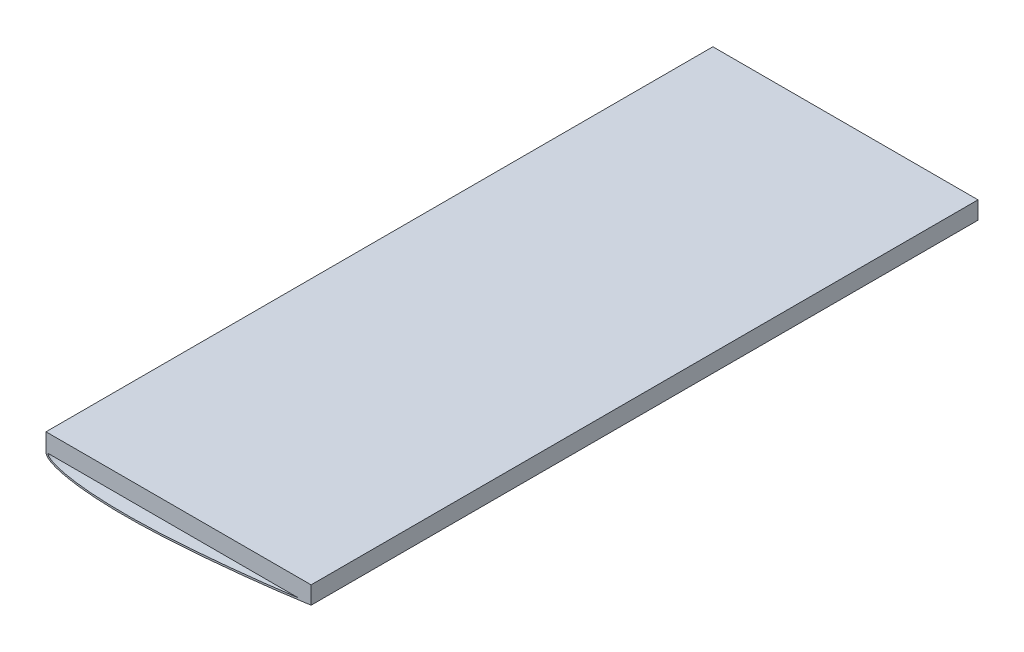
ISO-10303-21;
HEADER;
FILE_DESCRIPTION(('STEP AP214'),'2;1');
FILE_NAME('part.step','',(''),(''),'','','');
FILE_SCHEMA(('AUTOMOTIVE_DESIGN { 1 0 10303 214 1 1 1 1 }'));
ENDSEC;
DATA;
#1=APPLICATION_CONTEXT('core data for automotive mechanical design processes');
#2=APPLICATION_PROTOCOL_DEFINITION('international standard','automotive_design',2000,#1);
#3=PRODUCT_CONTEXT('',#1,'mechanical');
#4=PRODUCT('Part','Part','',(#3));
#5=PRODUCT_RELATED_PRODUCT_CATEGORY('part','',(#4));
#6=PRODUCT_DEFINITION_FORMATION('','',#4);
#7=PRODUCT_DEFINITION_CONTEXT('part definition',#1,'design');
#8=PRODUCT_DEFINITION('design','',#6,#7);
#9=PRODUCT_DEFINITION_SHAPE('','',#8);
#10=(LENGTH_UNIT() NAMED_UNIT(*) SI_UNIT(.MILLI.,.METRE.));
#11=(NAMED_UNIT(*) PLANE_ANGLE_UNIT() SI_UNIT($,.RADIAN.));
#12=(NAMED_UNIT(*) SI_UNIT($,.STERADIAN.) SOLID_ANGLE_UNIT());
#13=UNCERTAINTY_MEASURE_WITH_UNIT(LENGTH_MEASURE(1.E-05),#10,'distance_accuracy_value','');
#14=(GEOMETRIC_REPRESENTATION_CONTEXT(3) GLOBAL_UNCERTAINTY_ASSIGNED_CONTEXT((#13)) GLOBAL_UNIT_ASSIGNED_CONTEXT((#10,
#11,#12)) REPRESENTATION_CONTEXT('',''));
#15=CARTESIAN_POINT('',(0.,0.,0.));
#16=DIRECTION('',(0.,0.,1.));
#17=DIRECTION('',(1.,0.,0.));
#18=AXIS2_PLACEMENT_3D('',#15,#16,#17);
#19=CARTESIAN_POINT('',(73.9593776237791,7.91362684742064,0.));
#20=DIRECTION('',(0.,0.,-1.));
#21=DIRECTION('',(-1.,0.,0.));
#22=AXIS2_PLACEMENT_3D('',#19,#20,#21);
#23=PLANE('',#22);
#24=CARTESIAN_POINT('',(1.00345433177514,2.21139296111006E-12,0.));
#25=CARTESIAN_POINT('',(1.01006277716516,-0.0776382549222592,0.));
#26=CARTESIAN_POINT('',(1.02736996072205,-0.251809473010658,0.));
#27=CARTESIAN_POINT('',(1.05545790737324,-0.39717128165524,0.));
#28=CARTESIAN_POINT('',(1.10122729147491,-0.534433247929432,0.));
#29=CARTESIAN_POINT('',(1.2070060140526,-0.758973422297372,0.));
#30=CARTESIAN_POINT('',(1.39820169123991,-1.05450326915682,0.));
#31=CARTESIAN_POINT('',(1.78376943357382,-1.49652619711913,0.));
#32=CARTESIAN_POINT('',(2.41521318501003,-2.02030968090792,0.));
#33=CARTESIAN_POINT('',(3.5833083365114,-2.75144190561193,0.));
#34=CARTESIAN_POINT('',(5.2207174054757,-3.50583222163235,0.));
#35=CARTESIAN_POINT('',(7.99073904270306,-4.47786552088087,0.));
#36=CARTESIAN_POINT('',(11.6041135023148,-5.3895546083372,0.));
#37=CARTESIAN_POINT('',(16.0269639299858,-6.19324892029823,0.));
#38=CARTESIAN_POINT('',(20.4979671718237,-6.79235105021753,0.));
#39=CARTESIAN_POINT('',(26.4943879599962,-7.38356226543266,0.));
#40=CARTESIAN_POINT('',(34.0293455913172,-7.81417481798339,0.));
#41=CARTESIAN_POINT('',(43.0946015483297,-7.98650915253986,0.));
#42=CARTESIAN_POINT('',(52.1685724547205,-7.89775929132822,0.));
#43=CARTESIAN_POINT('',(61.2431322861648,-7.60624472281697,0.));
#44=CARTESIAN_POINT('',(73.3387179349281,-7.00140776455579,0.));
#45=CARTESIAN_POINT('',(88.4459886292648,-5.91846879559462,0.));
#46=CARTESIAN_POINT('',(106.550096146803,-4.25481208598084,0.));
#47=CARTESIAN_POINT('',(124.627143732398,-2.29752292089651,0.));
#48=CARTESIAN_POINT('',(136.654844648472,-0.802687350619493,0.));
#49=CARTESIAN_POINT('',(142.661446075035,3.04530706207728E-12,0.));
#50=B_SPLINE_CURVE_WITH_KNOTS('',3,(#24,#25,#26,#27,#28,#29,#30,#31,#32,#33,#34,#35,#36,#37,#38,
#39,#40,#41,#42,#43,#44,#45,#46,#47,#48,#49),.UNSPECIFIED.,.F.,.F.,(4,1,1,1,1,1,1,1,1,1,1,1,1,1,
1,1,1,1,1,1,1,1,1,4),(0.00055306123740472,0.00241221186622204,0.00427136249503936,
0.00613051312385668,0.00798966375267401,0.0117079650103086,0.0154262662679433,
0.0228628687832126,0.0302994712984819,0.0451726763290204,0.060045881359559,0.0897922914206361,
0.119538701481713,0.14928511154279,0.179031521603868,0.238524341726022,0.298017161848176,
0.35750998197033,0.417002802092485,0.476495622214639,0.595481262458947,0.714466902703256,
0.833452542947565,0.952438183191873),.UNSPECIFIED.);
#51=CARTESIAN_POINT('',(1.00345433177514,0.,0.));
#52=VERTEX_POINT('',#51);
#53=CARTESIAN_POINT('',(142.661446075035,3.04530706207728E-12,0.));
#54=VERTEX_POINT('',#53);
#55=EDGE_CURVE('E116',#52,#54,#50,.T.);
#56=ORIENTED_EDGE('',*,*,#55,.T.);
#57=DIRECTION('',(-1.,0.,0.));
#58=VECTOR('',#57,1.);
#59=CARTESIAN_POINT('',(0.,0.,0.));
#60=LINE('',#59,#58);
#61=EDGE_CURVE('E110',#54,#52,#60,.T.);
#62=ORIENTED_EDGE('',*,*,#61,.T.);
#63=EDGE_LOOP('',(#56,#62));
#64=FACE_BOUND('',#63,.T.);
#65=DIRECTION('',(0.,-1.,0.));
#66=VECTOR('',#65,1.);
#67=CARTESIAN_POINT('',(150.,10.,0.));
#68=LINE('',#67,#66);
#69=CARTESIAN_POINT('',(150.,10.,0.));
#70=VERTEX_POINT('',#69);
#71=CARTESIAN_POINT('',(150.,0.,0.));
#72=VERTEX_POINT('',#71);
#73=EDGE_CURVE('E114',#70,#72,#68,.T.);
#74=ORIENTED_EDGE('',*,*,#73,.T.);
#75=CARTESIAN_POINT('',(6.43538250505347E-13,1.77635703591191E-12,0.));
#76=CARTESIAN_POINT('',(0.0177376787998455,-0.215631790192353,0.));
#77=CARTESIAN_POINT('',(0.0541247272774031,-0.65797853081827,0.));
#78=CARTESIAN_POINT('',(0.343214491646014,-1.29886256852248,0.));
#79=CARTESIAN_POINT('',(0.793518335307777,-1.91545308538017,0.));
#80=CARTESIAN_POINT('',(1.4185937385033,-2.51041162089577,0.));
#81=CARTESIAN_POINT('',(2.21044072610108,-3.08584076004222,0.));
#82=CARTESIAN_POINT('',(3.16984033745948,-3.6422902701145,0.));
#83=CARTESIAN_POINT('',(4.29476246222991,-4.17912910417955,0.));
#84=CARTESIAN_POINT('',(5.58341356907608,-4.69513940992403,0.));
#85=CARTESIAN_POINT('',(7.03317259205481,-5.18878374333077,0.));
#86=CARTESIAN_POINT('',(8.64096444597695,-5.65840604873474,0.));
#87=CARTESIAN_POINT('',(11.0808665026304,-6.27289235058293,0.));
#88=CARTESIAN_POINT('',(14.5024468626398,-6.95545406858926,0.));
#89=CARTESIAN_POINT('',(19.0332651731454,-7.62778010369679,0.));
#90=CARTESIAN_POINT('',(24.0847382425471,-8.16948510481021,0.));
#91=CARTESIAN_POINT('',(29.6103003795531,-8.57335056911082,0.));
#92=CARTESIAN_POINT('',(36.6534461757643,-8.88420481359231,0.));
#93=CARTESIAN_POINT('',(45.2685528659173,-8.99448588105845,0.));
#94=CARTESIAN_POINT('',(55.4492469291888,-8.82398055942588,0.));
#95=CARTESIAN_POINT('',(67.2471798380365,-8.34657326807739,0.));
#96=CARTESIAN_POINT('',(80.3841274907161,-7.52487589483598,0.));
#97=CARTESIAN_POINT('',(94.4750896656358,-6.38138479152716,0.));
#98=CARTESIAN_POINT('',(108.784193237315,-5.01561269216194,0.));
#99=CARTESIAN_POINT('',(123.127907022394,-3.46129711721086,0.));
#100=CARTESIAN_POINT('',(136.579140490008,-1.82819578052965,0.));
#101=CARTESIAN_POINT('',(145.420848795192,-0.644801769860001,0.));
#102=CARTESIAN_POINT('',(149.505193272768,-0.070051229078369,0.));
#103=CARTESIAN_POINT('',(149.970810303825,-0.00413247027612191,0.));
#104=CARTESIAN_POINT('',(150.000000000001,1.77635683940024E-12,0.));
#105=B_SPLINE_CURVE_WITH_KNOTS('',3,(#75,#76,#77,#78,#79,#80,#81,#82,#83,#84,#85,#86,#87,#88,
#89,#90,#91,#92,#93,#94,#95,#96,#97,#98,#99,#100,#101,#102,#103,#104),.UNSPECIFIED.,.F.,.F.,(4,
1,1,1,1,1,1,1,1,1,1,1,1,1,1,1,1,1,1,1,1,1,1,1,1,1,1,4),(0.,0.00421754175159676,
0.00865185901203598,0.013562306112597,0.0191370143035422,0.0254995560399083,0.0327261684508418,
0.0408616428239496,0.049929831579304,0.0599401249287409,0.0708919813887169,0.082777029169175,
0.109285667338437,0.139301077750872,0.172602406915682,0.208924358464581,0.247964734529063,
0.310881145592701,0.377906082539904,0.447678537728095,0.542484026957861,0.636086647696326,
0.724985378551976,0.824439815821109,0.919092538955119,0.990775422468578,0.999421707975584,1.),.UNSPECIFIED.);
#106=CARTESIAN_POINT('',(6.43538250505347E-13,1.77635703591191E-12,0.));
#107=VERTEX_POINT('',#106);
#108=EDGE_CURVE('E106',#107,#72,#105,.T.);
#109=ORIENTED_EDGE('',*,*,#108,.F.);
#110=DIRECTION('',(0.,-1.,0.));
#111=VECTOR('',#110,1.);
#112=CARTESIAN_POINT('',(0.,10.,0.));
#113=LINE('',#112,#111);
#114=CARTESIAN_POINT('',(0.,10.,0.));
#115=VERTEX_POINT('',#114);
#116=EDGE_CURVE('E53',#115,#107,#113,.T.);
#117=ORIENTED_EDGE('',*,*,#116,.F.);
#118=DIRECTION('',(-1.,0.,0.));
#119=VECTOR('',#118,1.);
#120=CARTESIAN_POINT('',(0.,10.,0.));
#121=LINE('',#120,#119);
#122=EDGE_CURVE('E156',#70,#115,#121,.T.);
#123=ORIENTED_EDGE('',*,*,#122,.F.);
#124=EDGE_LOOP('',(#74,#109,#117,#123));
#125=FACE_BOUND('',#124,.T.);
#126=ADVANCED_FACE('F35',(#64,#125),#23,.T.);
#127=CARTESIAN_POINT('',(1.00345433177514,2.21139296111006E-12,528.394615333754));
#128=CARTESIAN_POINT('',(1.01006277716516,-0.0776382549222592,528.394615333754));
#129=CARTESIAN_POINT('',(1.02736996072205,-0.251809473010658,528.394615333754));
#130=CARTESIAN_POINT('',(1.05545790737324,-0.39717128165524,528.394615333754));
#131=CARTESIAN_POINT('',(1.10122729147491,-0.534433247929432,528.394615333754));
#132=CARTESIAN_POINT('',(1.2070060140526,-0.758973422297372,528.394615333754));
#133=CARTESIAN_POINT('',(1.39820169123991,-1.05450326915682,528.394615333754));
#134=CARTESIAN_POINT('',(1.78376943357382,-1.49652619711913,528.394615333754));
#135=CARTESIAN_POINT('',(2.41521318501003,-2.02030968090792,528.394615333754));
#136=CARTESIAN_POINT('',(3.5833083365114,-2.75144190561193,528.394615333754));
#137=CARTESIAN_POINT('',(5.2207174054757,-3.50583222163235,528.394615333754));
#138=CARTESIAN_POINT('',(7.99073904270306,-4.47786552088087,528.394615333754));
#139=CARTESIAN_POINT('',(11.6041135023148,-5.3895546083372,528.394615333754));
#140=CARTESIAN_POINT('',(16.0269639299858,-6.19324892029823,528.394615333754));
#141=CARTESIAN_POINT('',(20.4979671718237,-6.79235105021753,528.394615333754));
#142=CARTESIAN_POINT('',(26.4943879599962,-7.38356226543266,528.394615333754));
#143=CARTESIAN_POINT('',(34.0293455913172,-7.81417481798339,528.394615333754));
#144=CARTESIAN_POINT('',(43.0946015483297,-7.98650915253986,528.394615333754));
#145=CARTESIAN_POINT('',(52.1685724547205,-7.89775929132822,528.394615333754));
#146=CARTESIAN_POINT('',(61.2431322861648,-7.60624472281697,528.394615333754));
#147=CARTESIAN_POINT('',(73.3387179349281,-7.00140776455579,528.394615333754));
#148=CARTESIAN_POINT('',(88.4459886292648,-5.91846879559462,528.394615333754));
#149=CARTESIAN_POINT('',(106.550096146803,-4.25481208598084,528.394615333754));
#150=CARTESIAN_POINT('',(124.627143732398,-2.29752292089651,528.394615333754));
#151=CARTESIAN_POINT('',(136.654844648472,-0.802687350619493,528.394615333754));
#152=CARTESIAN_POINT('',(142.661446075035,3.04530706207728E-12,528.394615333754));
#153=B_SPLINE_CURVE_WITH_KNOTS('',3,(#127,#128,#129,#130,#131,#132,#133,#134,#135,#136,#137,
#138,#139,#140,#141,#142,#143,#144,#145,#146,#147,#148,#149,#150,#151,#152),.UNSPECIFIED.,.F.,
.F.,(4,1,1,1,1,1,1,1,1,1,1,1,1,1,1,1,1,1,1,1,1,1,1,4),(0.00055306123740472,0.00241221186622204,
0.00427136249503936,0.00613051312385668,0.00798966375267401,0.0117079650103086,
0.0154262662679433,0.0228628687832126,0.0302994712984819,0.0451726763290204,0.060045881359559,
0.0897922914206361,0.119538701481713,0.14928511154279,0.179031521603868,0.238524341726022,
0.298017161848176,0.35750998197033,0.417002802092485,0.476495622214639,0.595481262458947,
0.714466902703256,0.833452542947565,0.952438183191873),.UNSPECIFIED.);
#154=DIRECTION('',(0.,0.,-1.));
#155=VECTOR('',#154,1.);
#156=SURFACE_OF_LINEAR_EXTRUSION('',#153,#155);
#157=CARTESIAN_POINT('',(1.00345433177514,2.21139296111006E-12,377.319789154611));
#158=CARTESIAN_POINT('',(1.01006277716516,-0.0776382549222592,377.319789154611));
#159=CARTESIAN_POINT('',(1.02736996072205,-0.251809473010658,377.319789154611));
#160=CARTESIAN_POINT('',(1.05545790737324,-0.39717128165524,377.319789154611));
#161=CARTESIAN_POINT('',(1.10122729147491,-0.534433247929432,377.319789154611));
#162=CARTESIAN_POINT('',(1.2070060140526,-0.758973422297372,377.319789154611));
#163=CARTESIAN_POINT('',(1.39820169123991,-1.05450326915682,377.319789154611));
#164=CARTESIAN_POINT('',(1.78376943357382,-1.49652619711913,377.319789154611));
#165=CARTESIAN_POINT('',(2.41521318501003,-2.02030968090792,377.319789154611));
#166=CARTESIAN_POINT('',(3.5833083365114,-2.75144190561193,377.319789154611));
#167=CARTESIAN_POINT('',(5.2207174054757,-3.50583222163235,377.319789154611));
#168=CARTESIAN_POINT('',(7.99073904270306,-4.47786552088087,377.319789154611));
#169=CARTESIAN_POINT('',(11.6041135023148,-5.3895546083372,377.319789154611));
#170=CARTESIAN_POINT('',(16.0269639299858,-6.19324892029823,377.319789154611));
#171=CARTESIAN_POINT('',(20.4979671718237,-6.79235105021753,377.319789154611));
#172=CARTESIAN_POINT('',(26.4943879599962,-7.38356226543266,377.319789154611));
#173=CARTESIAN_POINT('',(34.0293455913172,-7.81417481798339,377.319789154611));
#174=CARTESIAN_POINT('',(43.0946015483297,-7.98650915253986,377.319789154611));
#175=CARTESIAN_POINT('',(52.1685724547205,-7.89775929132822,377.319789154611));
#176=CARTESIAN_POINT('',(61.2431322861648,-7.60624472281697,377.319789154611));
#177=CARTESIAN_POINT('',(73.3387179349281,-7.00140776455579,377.319789154611));
#178=CARTESIAN_POINT('',(88.4459886292648,-5.91846879559462,377.319789154611));
#179=CARTESIAN_POINT('',(106.550096146803,-4.25481208598084,377.319789154611));
#180=CARTESIAN_POINT('',(124.627143732398,-2.29752292089651,377.319789154611));
#181=CARTESIAN_POINT('',(136.654844648472,-0.802687350619493,377.319789154611));
#182=CARTESIAN_POINT('',(142.661446075035,3.04530706207728E-12,377.319789154611));
#183=B_SPLINE_CURVE_WITH_KNOTS('',3,(#157,#158,#159,#160,#161,#162,#163,#164,#165,#166,#167,
#168,#169,#170,#171,#172,#173,#174,#175,#176,#177,#178,#179,#180,#181,#182),.UNSPECIFIED.,.F.,
.F.,(4,1,1,1,1,1,1,1,1,1,1,1,1,1,1,1,1,1,1,1,1,1,1,4),(0.00055306123740472,0.00241221186622204,
0.00427136249503936,0.00613051312385668,0.00798966375267401,0.0117079650103086,
0.0154262662679433,0.0228628687832126,0.0302994712984819,0.0451726763290204,0.060045881359559,
0.0897922914206361,0.119538701481713,0.14928511154279,0.179031521603868,0.238524341726022,
0.298017161848176,0.35750998197033,0.417002802092485,0.476495622214639,0.595481262458947,
0.714466902703256,0.833452542947565,0.952438183191873),.UNSPECIFIED.);
#184=CARTESIAN_POINT('',(142.661446075035,3.04530706207728E-12,377.319789154611));
#185=VERTEX_POINT('',#184);
#186=CARTESIAN_POINT('',(1.00345433177515,0.,377.319789154611));
#187=VERTEX_POINT('',#186);
#188=EDGE_CURVE('E11',#185,#187,#183,.F.);
#189=ORIENTED_EDGE('',*,*,#188,.F.);
#190=DIRECTION('',(0.,0.,-1.));
#191=VECTOR('',#190,1.);
#192=CARTESIAN_POINT('',(142.661446075035,3.04530706207728E-12,528.394615333754));
#193=LINE('',#192,#191);
#194=EDGE_CURVE('E151',#185,#54,#193,.T.);
#195=ORIENTED_EDGE('',*,*,#194,.T.);
#196=ORIENTED_EDGE('',*,*,#55,.F.);
#197=DIRECTION('',(0.,0.,-1.));
#198=VECTOR('',#197,1.);
#199=CARTESIAN_POINT('',(1.00345433177514,2.21139296111006E-12,528.394615333754));
#200=LINE('',#199,#198);
#201=EDGE_CURVE('E168',#187,#52,#200,.T.);
#202=ORIENTED_EDGE('',*,*,#201,.F.);
#203=EDGE_LOOP('',(#189,#195,#196,#202));
#204=FACE_BOUND('',#203,.T.);
#205=ADVANCED_FACE('F132',(#204),#156,.T.);
#206=CARTESIAN_POINT('',(73.9593776237778,-7.91362684741867,377.319789154611));
#207=DIRECTION('',(0.,0.,-1.));
#208=DIRECTION('',(0.,-1.,0.));
#209=AXIS2_PLACEMENT_3D('',#206,#207,#208);
#210=PLANE('',#209);
#211=DIRECTION('',(1.,0.,0.));
#212=VECTOR('',#211,1.);
#213=CARTESIAN_POINT('',(0.,0.,377.319789154611));
#214=LINE('',#213,#212);
#215=EDGE_CURVE('E61',#187,#185,#214,.T.);
#216=ORIENTED_EDGE('',*,*,#215,.T.);
#217=ORIENTED_EDGE('',*,*,#188,.T.);
#218=EDGE_LOOP('',(#216,#217));
#219=FACE_BOUND('',#218,.T.);
#220=CARTESIAN_POINT('',(6.43538250505347E-13,1.77635703591191E-12,377.319789154611));
#221=CARTESIAN_POINT('',(0.0177376787998455,-0.215631790192353,377.319789154611));
#222=CARTESIAN_POINT('',(0.0541247272774031,-0.65797853081827,377.319789154611));
#223=CARTESIAN_POINT('',(0.343214491646014,-1.29886256852248,377.319789154611));
#224=CARTESIAN_POINT('',(0.793518335307777,-1.91545308538017,377.319789154611));
#225=CARTESIAN_POINT('',(1.4185937385033,-2.51041162089577,377.319789154611));
#226=CARTESIAN_POINT('',(2.21044072610108,-3.08584076004222,377.319789154611));
#227=CARTESIAN_POINT('',(3.16984033745948,-3.6422902701145,377.319789154611));
#228=CARTESIAN_POINT('',(4.29476246222991,-4.17912910417955,377.319789154611));
#229=CARTESIAN_POINT('',(5.58341356907608,-4.69513940992403,377.319789154611));
#230=CARTESIAN_POINT('',(7.03317259205481,-5.18878374333077,377.319789154611));
#231=CARTESIAN_POINT('',(8.64096444597695,-5.65840604873474,377.319789154611));
#232=CARTESIAN_POINT('',(11.0808665026304,-6.27289235058293,377.319789154611));
#233=CARTESIAN_POINT('',(14.5024468626398,-6.95545406858926,377.319789154611));
#234=CARTESIAN_POINT('',(19.0332651731454,-7.62778010369679,377.319789154611));
#235=CARTESIAN_POINT('',(24.0847382425471,-8.16948510481021,377.319789154611));
#236=CARTESIAN_POINT('',(29.6103003795531,-8.57335056911082,377.319789154611));
#237=CARTESIAN_POINT('',(36.6534461757643,-8.88420481359231,377.319789154611));
#238=CARTESIAN_POINT('',(45.2685528659173,-8.99448588105845,377.319789154611));
#239=CARTESIAN_POINT('',(55.4492469291888,-8.82398055942588,377.319789154611));
#240=CARTESIAN_POINT('',(67.2471798380365,-8.34657326807739,377.319789154611));
#241=CARTESIAN_POINT('',(80.3841274907161,-7.52487589483598,377.319789154611));
#242=CARTESIAN_POINT('',(94.4750896656358,-6.38138479152716,377.319789154611));
#243=CARTESIAN_POINT('',(108.784193237315,-5.01561269216194,377.319789154611));
#244=CARTESIAN_POINT('',(123.127907022394,-3.46129711721086,377.319789154611));
#245=CARTESIAN_POINT('',(136.579140490008,-1.82819578052965,377.319789154611));
#246=CARTESIAN_POINT('',(145.420848795192,-0.644801769860001,377.319789154611));
#247=CARTESIAN_POINT('',(149.505193272768,-0.070051229078369,377.319789154611));
#248=CARTESIAN_POINT('',(149.970810303825,-0.00413247027612191,377.319789154611));
#249=CARTESIAN_POINT('',(150.000000000001,1.77635683940024E-12,377.319789154611));
#250=B_SPLINE_CURVE_WITH_KNOTS('',3,(#220,#221,#222,#223,#224,#225,#226,#227,#228,#229,#230,
#231,#232,#233,#234,#235,#236,#237,#238,#239,#240,#241,#242,#243,#244,#245,#246,#247,#248,#249),
.UNSPECIFIED.,.F.,.F.,(4,1,1,1,1,1,1,1,1,1,1,1,1,1,1,1,1,1,1,1,1,1,1,1,1,1,1,4),(0.,
0.00421754175159676,0.00865185901203598,0.013562306112597,0.0191370143035422,0.0254995560399083,
0.0327261684508418,0.0408616428239496,0.049929831579304,0.0599401249287409,0.0708919813887169,
0.082777029169175,0.109285667338437,0.139301077750872,0.172602406915682,0.208924358464581,
0.247964734529063,0.310881145592701,0.377906082539904,0.447678537728095,0.542484026957861,
0.636086647696326,0.724985378551976,0.824439815821109,0.919092538955119,0.990775422468578,
0.999421707975584,1.),.UNSPECIFIED.);
#251=CARTESIAN_POINT('',(150.,0.,377.319789154611));
#252=VERTEX_POINT('',#251);
#253=CARTESIAN_POINT('',(0.,0.,377.319789154611));
#254=VERTEX_POINT('',#253);
#255=EDGE_CURVE('E40',#252,#254,#250,.F.);
#256=ORIENTED_EDGE('',*,*,#255,.F.);
#257=DIRECTION('',(0.,-1.,0.));
#258=VECTOR('',#257,1.);
#259=CARTESIAN_POINT('',(150.,10.,377.319789154611));
#260=LINE('',#259,#258);
#261=CARTESIAN_POINT('',(150.,10.,377.319789154611));
#262=VERTEX_POINT('',#261);
#263=EDGE_CURVE('E97',#262,#252,#260,.T.);
#264=ORIENTED_EDGE('',*,*,#263,.F.);
#265=DIRECTION('',(1.,0.,0.));
#266=VECTOR('',#265,1.);
#267=CARTESIAN_POINT('',(0.,10.,377.319789154611));
#268=LINE('',#267,#266);
#269=CARTESIAN_POINT('',(0.,10.,377.319789154611));
#270=VERTEX_POINT('',#269);
#271=EDGE_CURVE('E163',#270,#262,#268,.T.);
#272=ORIENTED_EDGE('',*,*,#271,.F.);
#273=DIRECTION('',(0.,-1.,0.));
#274=VECTOR('',#273,1.);
#275=CARTESIAN_POINT('',(0.,10.,377.319789154611));
#276=LINE('',#275,#274);
#277=EDGE_CURVE('E100',#270,#254,#276,.T.);
#278=ORIENTED_EDGE('',*,*,#277,.T.);
#279=EDGE_LOOP('',(#256,#264,#272,#278));
#280=FACE_BOUND('',#279,.T.);
#281=ADVANCED_FACE('F95',(#219,#280),#210,.F.);
#282=CARTESIAN_POINT('',(6.43538250505347E-13,1.77635703591191E-12,528.394615333754));
#283=CARTESIAN_POINT('',(0.0177376787998455,-0.215631790192353,528.394615333754));
#284=CARTESIAN_POINT('',(0.0541247272774031,-0.65797853081827,528.394615333754));
#285=CARTESIAN_POINT('',(0.343214491646014,-1.29886256852248,528.394615333754));
#286=CARTESIAN_POINT('',(0.793518335307777,-1.91545308538017,528.394615333754));
#287=CARTESIAN_POINT('',(1.4185937385033,-2.51041162089577,528.394615333754));
#288=CARTESIAN_POINT('',(2.21044072610108,-3.08584076004222,528.394615333754));
#289=CARTESIAN_POINT('',(3.16984033745948,-3.6422902701145,528.394615333754));
#290=CARTESIAN_POINT('',(4.29476246222991,-4.17912910417955,528.394615333754));
#291=CARTESIAN_POINT('',(5.58341356907608,-4.69513940992403,528.394615333754));
#292=CARTESIAN_POINT('',(7.03317259205481,-5.18878374333077,528.394615333754));
#293=CARTESIAN_POINT('',(8.64096444597695,-5.65840604873474,528.394615333754));
#294=CARTESIAN_POINT('',(11.0808665026304,-6.27289235058293,528.394615333754));
#295=CARTESIAN_POINT('',(14.5024468626398,-6.95545406858926,528.394615333754));
#296=CARTESIAN_POINT('',(19.0332651731454,-7.62778010369679,528.394615333754));
#297=CARTESIAN_POINT('',(24.0847382425471,-8.16948510481021,528.394615333754));
#298=CARTESIAN_POINT('',(29.6103003795531,-8.57335056911082,528.394615333754));
#299=CARTESIAN_POINT('',(36.6534461757643,-8.88420481359231,528.394615333754));
#300=CARTESIAN_POINT('',(45.2685528659173,-8.99448588105845,528.394615333754));
#301=CARTESIAN_POINT('',(55.4492469291888,-8.82398055942588,528.394615333754));
#302=CARTESIAN_POINT('',(67.2471798380365,-8.34657326807739,528.394615333754));
#303=CARTESIAN_POINT('',(80.3841274907161,-7.52487589483598,528.394615333754));
#304=CARTESIAN_POINT('',(94.4750896656358,-6.38138479152716,528.394615333754));
#305=CARTESIAN_POINT('',(108.784193237315,-5.01561269216194,528.394615333754));
#306=CARTESIAN_POINT('',(123.127907022394,-3.46129711721086,528.394615333754));
#307=CARTESIAN_POINT('',(136.579140490008,-1.82819578052965,528.394615333754));
#308=CARTESIAN_POINT('',(145.420848795192,-0.644801769860001,528.394615333754));
#309=CARTESIAN_POINT('',(149.505193272768,-0.070051229078369,528.394615333754));
#310=CARTESIAN_POINT('',(149.970810303825,-0.00413247027612191,528.394615333754));
#311=CARTESIAN_POINT('',(150.000000000001,1.77635683940024E-12,528.394615333754));
#312=B_SPLINE_CURVE_WITH_KNOTS('',3,(#282,#283,#284,#285,#286,#287,#288,#289,#290,#291,#292,
#293,#294,#295,#296,#297,#298,#299,#300,#301,#302,#303,#304,#305,#306,#307,#308,#309,#310,#311),
.UNSPECIFIED.,.F.,.F.,(4,1,1,1,1,1,1,1,1,1,1,1,1,1,1,1,1,1,1,1,1,1,1,1,1,1,1,4),(0.,
0.00421754175159676,0.00865185901203598,0.013562306112597,0.0191370143035422,0.0254995560399083,
0.0327261684508418,0.0408616428239496,0.049929831579304,0.0599401249287409,0.0708919813887169,
0.082777029169175,0.109285667338437,0.139301077750872,0.172602406915682,0.208924358464581,
0.247964734529063,0.310881145592701,0.377906082539904,0.447678537728095,0.542484026957861,
0.636086647696326,0.724985378551976,0.824439815821109,0.919092538955119,0.990775422468578,
0.999421707975584,1.),.UNSPECIFIED.);
#313=DIRECTION('',(0.,0.,-1.));
#314=VECTOR('',#313,1.);
#315=SURFACE_OF_LINEAR_EXTRUSION('',#312,#314);
#316=ORIENTED_EDGE('',*,*,#108,.T.);
#317=DIRECTION('',(0.,0.,-1.));
#318=VECTOR('',#317,1.);
#319=CARTESIAN_POINT('',(150.,0.,0.));
#320=LINE('',#319,#318);
#321=EDGE_CURVE('E104',#252,#72,#320,.T.);
#322=ORIENTED_EDGE('',*,*,#321,.F.);
#323=ORIENTED_EDGE('',*,*,#255,.T.);
#324=DIRECTION('',(0.,0.,-1.));
#325=VECTOR('',#324,1.);
#326=CARTESIAN_POINT('',(6.43538250505347E-13,1.77635703591191E-12,528.394615333754));
#327=LINE('',#326,#325);
#328=EDGE_CURVE('E102',#254,#107,#327,.T.);
#329=ORIENTED_EDGE('',*,*,#328,.T.);
#330=EDGE_LOOP('',(#316,#322,#323,#329));
#331=FACE_BOUND('',#330,.T.);
#332=ADVANCED_FACE('F37',(#331),#315,.F.);
#333=CARTESIAN_POINT('',(0.,10.,0.));
#334=DIRECTION('',(1.,0.,0.));
#335=DIRECTION('',(0.,0.,-1.));
#336=AXIS2_PLACEMENT_3D('',#333,#334,#335);
#337=PLANE('',#336);
#338=ORIENTED_EDGE('',*,*,#328,.F.);
#339=ORIENTED_EDGE('',*,*,#277,.F.);
#340=DIRECTION('',(0.,0.,1.));
#341=VECTOR('',#340,1.);
#342=CARTESIAN_POINT('',(0.,10.,0.));
#343=LINE('',#342,#341);
#344=EDGE_CURVE('E159',#115,#270,#343,.T.);
#345=ORIENTED_EDGE('',*,*,#344,.F.);
#346=ORIENTED_EDGE('',*,*,#116,.T.);
#347=EDGE_LOOP('',(#338,#339,#345,#346));
#348=FACE_BOUND('',#347,.T.);
#349=ADVANCED_FACE('F145',(#348),#337,.F.);
#350=CARTESIAN_POINT('',(150.,10.,0.));
#351=DIRECTION('',(-1.,0.,0.));
#352=DIRECTION('',(0.,0.,1.));
#353=AXIS2_PLACEMENT_3D('',#350,#351,#352);
#354=PLANE('',#353);
#355=ORIENTED_EDGE('',*,*,#321,.T.);
#356=ORIENTED_EDGE('',*,*,#73,.F.);
#357=DIRECTION('',(0.,0.,-1.));
#358=VECTOR('',#357,1.);
#359=CARTESIAN_POINT('',(150.,10.,0.));
#360=LINE('',#359,#358);
#361=EDGE_CURVE('E113',#262,#70,#360,.T.);
#362=ORIENTED_EDGE('',*,*,#361,.F.);
#363=ORIENTED_EDGE('',*,*,#263,.T.);
#364=EDGE_LOOP('',(#355,#356,#362,#363));
#365=FACE_BOUND('',#364,.T.);
#366=ADVANCED_FACE('F112',(#365),#354,.F.);
#367=CARTESIAN_POINT('',(0.,10.,0.));
#368=DIRECTION('',(0.,1.,0.));
#369=DIRECTION('',(0.,0.,1.));
#370=AXIS2_PLACEMENT_3D('',#367,#368,#369);
#371=PLANE('',#370);
#372=ORIENTED_EDGE('',*,*,#344,.T.);
#373=ORIENTED_EDGE('',*,*,#271,.T.);
#374=ORIENTED_EDGE('',*,*,#361,.T.);
#375=ORIENTED_EDGE('',*,*,#122,.T.);
#376=EDGE_LOOP('',(#372,#373,#374,#375));
#377=FACE_BOUND('',#376,.T.);
#378=ADVANCED_FACE('F166',(#377),#371,.T.);
#379=CARTESIAN_POINT('',(0.,0.,0.));
#380=DIRECTION('',(0.,1.,0.));
#381=DIRECTION('',(0.,0.,1.));
#382=AXIS2_PLACEMENT_3D('',#379,#380,#381);
#383=PLANE('',#382);
#384=ORIENTED_EDGE('',*,*,#61,.F.);
#385=ORIENTED_EDGE('',*,*,#194,.F.);
#386=ORIENTED_EDGE('',*,*,#215,.F.);
#387=ORIENTED_EDGE('',*,*,#201,.T.);
#388=EDGE_LOOP('',(#384,#385,#386,#387));
#389=FACE_BOUND('',#388,.T.);
#390=ADVANCED_FACE('F188',(#389),#383,.F.);
#391=CLOSED_SHELL('',(#126,#205,#281,#332,#349,#366,#378,#390));
#392=MANIFOLD_SOLID_BREP('B2',#391);
#393=ADVANCED_BREP_SHAPE_REPRESENTATION('',(#18,#392),#14);
#394=SHAPE_DEFINITION_REPRESENTATION(#9,#393);
ENDSEC;
END-ISO-10303-21;
